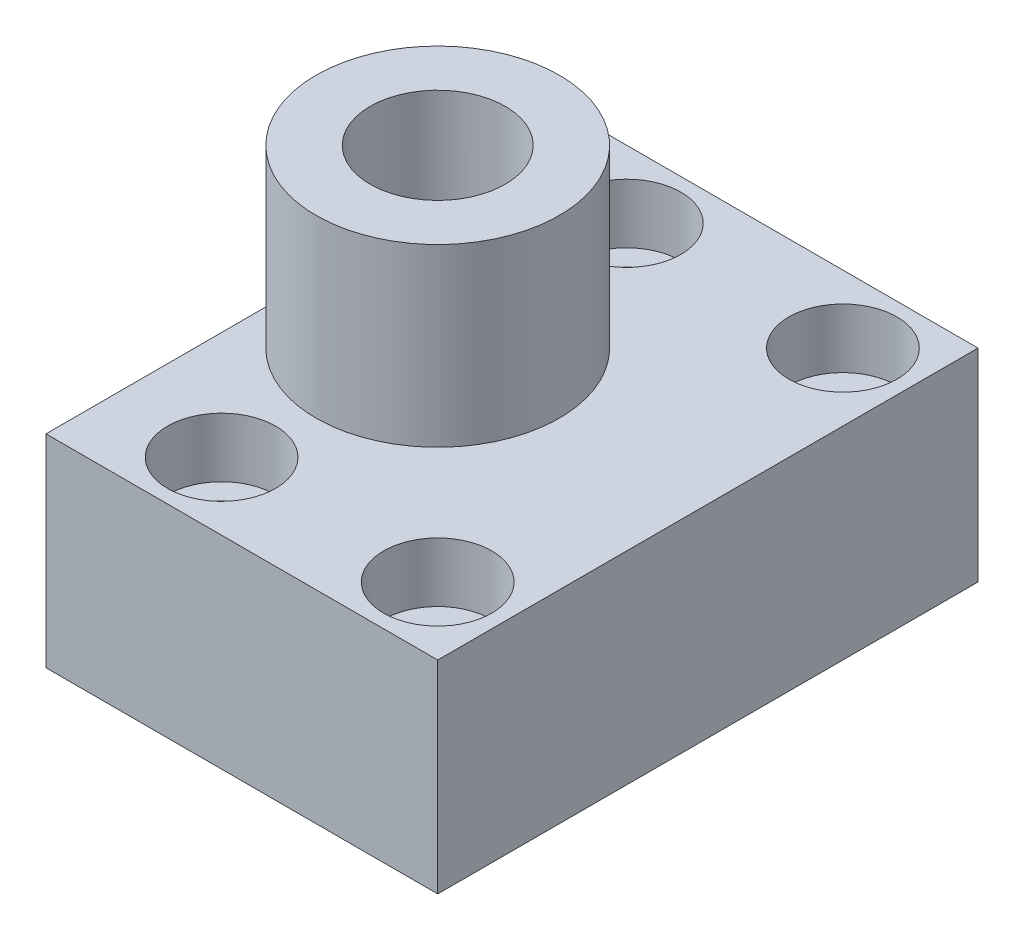
ISO-10303-21;
HEADER;
FILE_DESCRIPTION(('STEP AP214'),'2;1');
FILE_NAME('part.step','',(''),(''),'','','');
FILE_SCHEMA(('AUTOMOTIVE_DESIGN { 1 0 10303 214 1 1 1 1 }'));
ENDSEC;
DATA;
#1=APPLICATION_CONTEXT('core data for automotive mechanical design processes');
#2=APPLICATION_PROTOCOL_DEFINITION('international standard','automotive_design',2000,#1);
#3=PRODUCT_CONTEXT('',#1,'mechanical');
#4=PRODUCT('Part','Part','',(#3));
#5=PRODUCT_RELATED_PRODUCT_CATEGORY('part','',(#4));
#6=PRODUCT_DEFINITION_FORMATION('','',#4);
#7=PRODUCT_DEFINITION_CONTEXT('part definition',#1,'design');
#8=PRODUCT_DEFINITION('design','',#6,#7);
#9=PRODUCT_DEFINITION_SHAPE('','',#8);
#10=(LENGTH_UNIT() NAMED_UNIT(*) SI_UNIT(.MILLI.,.METRE.));
#11=(NAMED_UNIT(*) PLANE_ANGLE_UNIT() SI_UNIT($,.RADIAN.));
#12=(NAMED_UNIT(*) SI_UNIT($,.STERADIAN.) SOLID_ANGLE_UNIT());
#13=UNCERTAINTY_MEASURE_WITH_UNIT(LENGTH_MEASURE(1.E-05),#10,'distance_accuracy_value','');
#14=(GEOMETRIC_REPRESENTATION_CONTEXT(3) GLOBAL_UNCERTAINTY_ASSIGNED_CONTEXT((#13)) GLOBAL_UNIT_ASSIGNED_CONTEXT((#10,
#11,#12)) REPRESENTATION_CONTEXT('',''));
#15=CARTESIAN_POINT('',(0.,0.,0.));
#16=DIRECTION('',(0.,0.,1.));
#17=DIRECTION('',(1.,0.,0.));
#18=AXIS2_PLACEMENT_3D('',#15,#16,#17);
#19=CARTESIAN_POINT('',(-4.99999999999999,-26.,20.));
#20=DIRECTION('',(0.,1.,0.));
#21=DIRECTION('',(-1.,0.,0.));
#22=AXIS2_PLACEMENT_3D('',#19,#20,#21);
#23=CYLINDRICAL_SURFACE('',#22,5.);
#24=CARTESIAN_POINT('',(-5.,2.,20.));
#25=DIRECTION('',(0.,1.,0.));
#26=DIRECTION('',(-1.,0.,0.));
#27=AXIS2_PLACEMENT_3D('',#24,#25,#26);
#28=CIRCLE('',#27,5.);
#29=CARTESIAN_POINT('',(-10.,2.,20.));
#30=VERTEX_POINT('',#29);
#31=EDGE_CURVE('E108',#30,#30,#28,.T.);
#32=ORIENTED_EDGE('',*,*,#31,.T.);
#33=EDGE_LOOP('',(#32));
#34=FACE_BOUND('',#33,.T.);
#35=CARTESIAN_POINT('',(-4.99999999999999,-21.,20.));
#36=DIRECTION('',(0.,-1.,0.));
#37=DIRECTION('',(0.,0.,-1.));
#38=AXIS2_PLACEMENT_3D('',#35,#36,#37);
#39=CIRCLE('',#38,5.);
#40=CARTESIAN_POINT('',(-4.99999999999999,-21.,15.));
#41=VERTEX_POINT('',#40);
#42=EDGE_CURVE('E39',#41,#41,#39,.F.);
#43=ORIENTED_EDGE('',*,*,#42,.F.);
#44=EDGE_LOOP('',(#43));
#45=FACE_BOUND('',#44,.T.);
#46=ADVANCED_FACE('F35',(#34,#45),#23,.F.);
#47=CARTESIAN_POINT('',(0.,2.,40.));
#48=DIRECTION('',(0.,-1.,0.));
#49=DIRECTION('',(1.,0.,0.));
#50=AXIS2_PLACEMENT_3D('',#47,#48,#49);
#51=PLANE('',#50);
#52=ORIENTED_EDGE('',*,*,#31,.F.);
#53=EDGE_LOOP('',(#52));
#54=FACE_BOUND('',#53,.T.);
#55=CARTESIAN_POINT('',(-5.,2.,20.));
#56=DIRECTION('',(0.,1.,0.));
#57=DIRECTION('',(-1.,0.,0.));
#58=AXIS2_PLACEMENT_3D('',#55,#56,#57);
#59=CIRCLE('',#58,9.);
#60=CARTESIAN_POINT('',(-14.,2.,20.));
#61=VERTEX_POINT('',#60);
#62=EDGE_CURVE('E101',#61,#61,#59,.T.);
#63=ORIENTED_EDGE('',*,*,#62,.T.);
#64=EDGE_LOOP('',(#63));
#65=FACE_BOUND('',#64,.T.);
#66=ADVANCED_FACE('F142',(#54,#65),#51,.F.);
#67=CARTESIAN_POINT('',(7.5,-11.,40.));
#68=DIRECTION('',(0.,-1.,0.));
#69=DIRECTION('',(0.,0.,-1.));
#70=AXIS2_PLACEMENT_3D('',#67,#68,#69);
#71=PLANE('',#70);
#72=CARTESIAN_POINT('',(10.,-11.,35.));
#73=DIRECTION('',(0.,1.,0.));
#74=DIRECTION('',(0.,0.,1.));
#75=AXIS2_PLACEMENT_3D('',#72,#73,#74);
#76=CIRCLE('',#75,4.);
#77=CARTESIAN_POINT('',(10.,-11.,39.));
#78=VERTEX_POINT('',#77);
#79=EDGE_CURVE('E216',#78,#78,#76,.T.);
#80=ORIENTED_EDGE('',*,*,#79,.F.);
#81=EDGE_LOOP('',(#80));
#82=FACE_BOUND('',#81,.T.);
#83=CARTESIAN_POINT('',(10.,-11.,5.));
#84=DIRECTION('',(0.,1.,0.));
#85=DIRECTION('',(0.,0.,1.));
#86=AXIS2_PLACEMENT_3D('',#83,#84,#85);
#87=CIRCLE('',#86,4.);
#88=CARTESIAN_POINT('',(10.,-11.,9.));
#89=VERTEX_POINT('',#88);
#90=EDGE_CURVE('E233',#89,#89,#87,.T.);
#91=ORIENTED_EDGE('',*,*,#90,.F.);
#92=EDGE_LOOP('',(#91));
#93=FACE_BOUND('',#92,.T.);
#94=CARTESIAN_POINT('',(-6.,-11.,35.));
#95=DIRECTION('',(0.,1.,0.));
#96=DIRECTION('',(0.,0.,1.));
#97=AXIS2_PLACEMENT_3D('',#94,#95,#96);
#98=CIRCLE('',#97,4.);
#99=CARTESIAN_POINT('',(-6.,-11.,39.));
#100=VERTEX_POINT('',#99);
#101=EDGE_CURVE('E245',#100,#100,#98,.T.);
#102=ORIENTED_EDGE('',*,*,#101,.F.);
#103=EDGE_LOOP('',(#102));
#104=FACE_BOUND('',#103,.T.);
#105=CARTESIAN_POINT('',(-6.,-11.,5.));
#106=DIRECTION('',(0.,1.,0.));
#107=DIRECTION('',(0.,0.,1.));
#108=AXIS2_PLACEMENT_3D('',#105,#106,#107);
#109=CIRCLE('',#108,4.);
#110=CARTESIAN_POINT('',(-6.,-11.,9.));
#111=VERTEX_POINT('',#110);
#112=EDGE_CURVE('E257',#111,#111,#109,.T.);
#113=ORIENTED_EDGE('',*,*,#112,.F.);
#114=EDGE_LOOP('',(#113));
#115=FACE_BOUND('',#114,.T.);
#116=DIRECTION('',(-1.,0.,0.));
#117=VECTOR('',#116,1.);
#118=CARTESIAN_POINT('',(7.5,-11.,0.));
#119=LINE('',#118,#117);
#120=CARTESIAN_POINT('',(15.,-11.,0.));
#121=VERTEX_POINT('',#120);
#122=CARTESIAN_POINT('',(-14.,-11.,0.));
#123=VERTEX_POINT('',#122);
#124=EDGE_CURVE('E94',#121,#123,#119,.T.);
#125=ORIENTED_EDGE('',*,*,#124,.T.);
#126=DIRECTION('',(0.,0.,-1.));
#127=VECTOR('',#126,1.);
#128=CARTESIAN_POINT('',(-14.,-11.,40.));
#129=LINE('',#128,#127);
#130=CARTESIAN_POINT('',(-14.,-11.,20.));
#131=VERTEX_POINT('',#130);
#132=EDGE_CURVE('E88',#131,#123,#129,.T.);
#133=ORIENTED_EDGE('',*,*,#132,.F.);
#134=CARTESIAN_POINT('',(-5.,-11.,20.));
#135=DIRECTION('',(0.,-1.,0.));
#136=DIRECTION('',(0.,0.,-1.));
#137=AXIS2_PLACEMENT_3D('',#134,#135,#136);
#138=CIRCLE('',#137,9.);
#139=EDGE_CURVE('E91',#131,#131,#138,.F.);
#140=ORIENTED_EDGE('',*,*,#139,.F.);
#141=CARTESIAN_POINT('',(-14.,-11.,40.));
#142=VERTEX_POINT('',#141);
#143=EDGE_CURVE('E97',#142,#131,#129,.T.);
#144=ORIENTED_EDGE('',*,*,#143,.F.);
#145=DIRECTION('',(-1.,0.,0.));
#146=VECTOR('',#145,1.);
#147=CARTESIAN_POINT('',(7.5,-11.,40.));
#148=LINE('',#147,#146);
#149=CARTESIAN_POINT('',(15.,-11.,40.));
#150=VERTEX_POINT('',#149);
#151=EDGE_CURVE('E111',#150,#142,#148,.T.);
#152=ORIENTED_EDGE('',*,*,#151,.F.);
#153=DIRECTION('',(0.,0.,-1.));
#154=VECTOR('',#153,1.);
#155=CARTESIAN_POINT('',(15.,-11.,40.));
#156=LINE('',#155,#154);
#157=EDGE_CURVE('E117',#150,#121,#156,.T.);
#158=ORIENTED_EDGE('',*,*,#157,.T.);
#159=EDGE_LOOP('',(#125,#133,#140,#144,#152,#158));
#160=FACE_BOUND('',#159,.T.);
#161=ADVANCED_FACE('F37',(#82,#93,#104,#115,#160),#71,.F.);
#162=CARTESIAN_POINT('',(-14.,-26.,40.));
#163=DIRECTION('',(1.,0.,0.));
#164=DIRECTION('',(0.,1.,0.));
#165=AXIS2_PLACEMENT_3D('',#162,#163,#164);
#166=PLANE('',#165);
#167=DIRECTION('',(0.,-1.,0.));
#168=VECTOR('',#167,1.);
#169=CARTESIAN_POINT('',(-14.,-26.,40.));
#170=LINE('',#169,#168);
#171=CARTESIAN_POINT('',(-14.,-26.,40.));
#172=VERTEX_POINT('',#171);
#173=EDGE_CURVE('E76',#142,#172,#170,.T.);
#174=ORIENTED_EDGE('',*,*,#173,.F.);
#175=ORIENTED_EDGE('',*,*,#143,.T.);
#176=ORIENTED_EDGE('',*,*,#132,.T.);
#177=DIRECTION('',(0.,-1.,0.));
#178=VECTOR('',#177,1.);
#179=CARTESIAN_POINT('',(-14.,-26.,0.));
#180=LINE('',#179,#178);
#181=CARTESIAN_POINT('',(-14.,-26.,0.));
#182=VERTEX_POINT('',#181);
#183=EDGE_CURVE('E119',#123,#182,#180,.T.);
#184=ORIENTED_EDGE('',*,*,#183,.T.);
#185=DIRECTION('',(0.,0.,-1.));
#186=VECTOR('',#185,1.);
#187=CARTESIAN_POINT('',(-14.,-26.,40.));
#188=LINE('',#187,#186);
#189=EDGE_CURVE('E12',#172,#182,#188,.T.);
#190=ORIENTED_EDGE('',*,*,#189,.F.);
#191=EDGE_LOOP('',(#174,#175,#176,#184,#190));
#192=FACE_BOUND('',#191,.T.);
#193=ADVANCED_FACE('F128',(#192),#166,.F.);
#194=CARTESIAN_POINT('',(15.,-26.,40.));
#195=DIRECTION('',(0.,1.,0.));
#196=DIRECTION('',(0.,0.,1.));
#197=AXIS2_PLACEMENT_3D('',#194,#195,#196);
#198=PLANE('',#197);
#199=CARTESIAN_POINT('',(-4.99999999999999,-26.,20.));
#200=DIRECTION('',(0.,-1.,0.));
#201=DIRECTION('',(0.,0.,-1.));
#202=AXIS2_PLACEMENT_3D('',#199,#200,#201);
#203=CIRCLE('',#202,8.);
#204=CARTESIAN_POINT('',(-4.99999999999999,-26.,12.));
#205=VERTEX_POINT('',#204);
#206=EDGE_CURVE('E220',#205,#205,#203,.T.);
#207=ORIENTED_EDGE('',*,*,#206,.F.);
#208=EDGE_LOOP('',(#207));
#209=FACE_BOUND('',#208,.T.);
#210=CARTESIAN_POINT('',(10.,-26.,35.));
#211=DIRECTION('',(0.,1.,0.));
#212=DIRECTION('',(0.,0.,1.));
#213=AXIS2_PLACEMENT_3D('',#210,#211,#212);
#214=CIRCLE('',#213,2.25);
#215=CARTESIAN_POINT('',(10.,-26.,37.25));
#216=VERTEX_POINT('',#215);
#217=EDGE_CURVE('E230',#216,#216,#214,.T.);
#218=ORIENTED_EDGE('',*,*,#217,.T.);
#219=EDGE_LOOP('',(#218));
#220=FACE_BOUND('',#219,.T.);
#221=CARTESIAN_POINT('',(10.,-26.,5.));
#222=DIRECTION('',(0.,1.,0.));
#223=DIRECTION('',(0.,0.,1.));
#224=AXIS2_PLACEMENT_3D('',#221,#222,#223);
#225=CIRCLE('',#224,2.25);
#226=CARTESIAN_POINT('',(10.,-26.,7.25));
#227=VERTEX_POINT('',#226);
#228=EDGE_CURVE('E242',#227,#227,#225,.T.);
#229=ORIENTED_EDGE('',*,*,#228,.T.);
#230=EDGE_LOOP('',(#229));
#231=FACE_BOUND('',#230,.T.);
#232=CARTESIAN_POINT('',(-6.,-26.,35.));
#233=DIRECTION('',(0.,1.,0.));
#234=DIRECTION('',(0.,0.,1.));
#235=AXIS2_PLACEMENT_3D('',#232,#233,#234);
#236=CIRCLE('',#235,2.25);
#237=CARTESIAN_POINT('',(-6.,-26.,37.25));
#238=VERTEX_POINT('',#237);
#239=EDGE_CURVE('E254',#238,#238,#236,.T.);
#240=ORIENTED_EDGE('',*,*,#239,.T.);
#241=EDGE_LOOP('',(#240));
#242=FACE_BOUND('',#241,.T.);
#243=CARTESIAN_POINT('',(-6.,-26.,5.));
#244=DIRECTION('',(0.,1.,0.));
#245=DIRECTION('',(0.,0.,1.));
#246=AXIS2_PLACEMENT_3D('',#243,#244,#245);
#247=CIRCLE('',#246,2.25);
#248=CARTESIAN_POINT('',(-6.,-26.,7.25));
#249=VERTEX_POINT('',#248);
#250=EDGE_CURVE('E104',#249,#249,#247,.T.);
#251=ORIENTED_EDGE('',*,*,#250,.T.);
#252=EDGE_LOOP('',(#251));
#253=FACE_BOUND('',#252,.T.);
#254=DIRECTION('',(1.,0.,0.));
#255=VECTOR('',#254,1.);
#256=CARTESIAN_POINT('',(15.,-26.,0.));
#257=LINE('',#256,#255);
#258=CARTESIAN_POINT('',(15.,-26.,0.));
#259=VERTEX_POINT('',#258);
#260=EDGE_CURVE('E67',#182,#259,#257,.T.);
#261=ORIENTED_EDGE('',*,*,#260,.T.);
#262=DIRECTION('',(0.,0.,-1.));
#263=VECTOR('',#262,1.);
#264=CARTESIAN_POINT('',(15.,-26.,40.));
#265=LINE('',#264,#263);
#266=CARTESIAN_POINT('',(15.,-26.,40.));
#267=VERTEX_POINT('',#266);
#268=EDGE_CURVE('E45',#267,#259,#265,.T.);
#269=ORIENTED_EDGE('',*,*,#268,.F.);
#270=DIRECTION('',(1.,0.,0.));
#271=VECTOR('',#270,1.);
#272=CARTESIAN_POINT('',(15.,-26.,40.));
#273=LINE('',#272,#271);
#274=EDGE_CURVE('E114',#172,#267,#273,.T.);
#275=ORIENTED_EDGE('',*,*,#274,.F.);
#276=ORIENTED_EDGE('',*,*,#189,.T.);
#277=EDGE_LOOP('',(#261,#269,#275,#276));
#278=FACE_BOUND('',#277,.T.);
#279=ADVANCED_FACE('F129',(#209,#220,#231,#242,#253,#278),#198,.F.);
#280=CARTESIAN_POINT('',(15.,-11.,40.));
#281=DIRECTION('',(-1.,0.,0.));
#282=DIRECTION('',(0.,-1.,0.));
#283=AXIS2_PLACEMENT_3D('',#280,#281,#282);
#284=PLANE('',#283);
#285=DIRECTION('',(0.,1.,0.));
#286=VECTOR('',#285,1.);
#287=CARTESIAN_POINT('',(15.,-11.,0.));
#288=LINE('',#287,#286);
#289=EDGE_CURVE('E72',#259,#121,#288,.T.);
#290=ORIENTED_EDGE('',*,*,#289,.T.);
#291=ORIENTED_EDGE('',*,*,#157,.F.);
#292=DIRECTION('',(0.,1.,0.));
#293=VECTOR('',#292,1.);
#294=CARTESIAN_POINT('',(15.,-11.,40.));
#295=LINE('',#294,#293);
#296=EDGE_CURVE('E53',#267,#150,#295,.T.);
#297=ORIENTED_EDGE('',*,*,#296,.F.);
#298=ORIENTED_EDGE('',*,*,#268,.T.);
#299=EDGE_LOOP('',(#290,#291,#297,#298));
#300=FACE_BOUND('',#299,.T.);
#301=ADVANCED_FACE('F124',(#300),#284,.F.);
#302=CARTESIAN_POINT('',(15.,-11.,40.));
#303=DIRECTION('',(0.,0.,-1.));
#304=DIRECTION('',(-1.,0.,0.));
#305=AXIS2_PLACEMENT_3D('',#302,#303,#304);
#306=PLANE('',#305);
#307=ORIENTED_EDGE('',*,*,#151,.T.);
#308=ORIENTED_EDGE('',*,*,#173,.T.);
#309=ORIENTED_EDGE('',*,*,#274,.T.);
#310=ORIENTED_EDGE('',*,*,#296,.T.);
#311=EDGE_LOOP('',(#307,#308,#309,#310));
#312=FACE_BOUND('',#311,.T.);
#313=ADVANCED_FACE('F130',(#312),#306,.F.);
#314=CARTESIAN_POINT('',(15.,-11.,0.));
#315=DIRECTION('',(0.,0.,-1.));
#316=DIRECTION('',(-1.,0.,0.));
#317=AXIS2_PLACEMENT_3D('',#314,#315,#316);
#318=PLANE('',#317);
#319=ORIENTED_EDGE('',*,*,#183,.F.);
#320=ORIENTED_EDGE('',*,*,#124,.F.);
#321=ORIENTED_EDGE('',*,*,#289,.F.);
#322=ORIENTED_EDGE('',*,*,#260,.F.);
#323=EDGE_LOOP('',(#319,#320,#321,#322));
#324=FACE_BOUND('',#323,.T.);
#325=ADVANCED_FACE('F127',(#324),#318,.T.);
#326=CARTESIAN_POINT('',(-4.99999999999999,-60.9005420812239,20.));
#327=DIRECTION('',(0.,1.,0.));
#328=DIRECTION('',(-1.,0.,0.));
#329=AXIS2_PLACEMENT_3D('',#326,#327,#328);
#330=CYLINDRICAL_SURFACE('',#329,9.);
#331=ORIENTED_EDGE('',*,*,#62,.F.);
#332=EDGE_LOOP('',(#331));
#333=FACE_BOUND('',#332,.T.);
#334=ORIENTED_EDGE('',*,*,#139,.T.);
#335=EDGE_LOOP('',(#334));
#336=FACE_BOUND('',#335,.T.);
#337=ADVANCED_FACE('F100',(#333,#336),#330,.T.);
#338=CARTESIAN_POINT('',(-6.,-11.,5.));
#339=DIRECTION('',(0.,1.,0.));
#340=DIRECTION('',(0.,0.,1.));
#341=AXIS2_PLACEMENT_3D('',#338,#339,#340);
#342=CYLINDRICAL_SURFACE('',#341,2.25);
#343=ORIENTED_EDGE('',*,*,#250,.F.);
#344=EDGE_LOOP('',(#343));
#345=FACE_BOUND('',#344,.T.);
#346=CARTESIAN_POINT('',(-6.,-15.4,5.));
#347=DIRECTION('',(0.,1.,0.));
#348=DIRECTION('',(0.,0.,1.));
#349=AXIS2_PLACEMENT_3D('',#346,#347,#348);
#350=CIRCLE('',#349,2.25);
#351=CARTESIAN_POINT('',(-6.,-15.4,7.25));
#352=VERTEX_POINT('',#351);
#353=EDGE_CURVE('E263',#352,#352,#350,.T.);
#354=ORIENTED_EDGE('',*,*,#353,.T.);
#355=EDGE_LOOP('',(#354));
#356=FACE_BOUND('',#355,.T.);
#357=ADVANCED_FACE('F152',(#345,#356),#342,.F.);
#358=CARTESIAN_POINT('',(-3.75,-15.4,5.));
#359=DIRECTION('',(0.,-1.,0.));
#360=DIRECTION('',(0.,0.,-1.));
#361=AXIS2_PLACEMENT_3D('',#358,#359,#360);
#362=PLANE('',#361);
#363=ORIENTED_EDGE('',*,*,#353,.F.);
#364=EDGE_LOOP('',(#363));
#365=FACE_BOUND('',#364,.T.);
#366=CARTESIAN_POINT('',(-6.,-15.4,5.));
#367=DIRECTION('',(0.,1.,0.));
#368=DIRECTION('',(0.,0.,1.));
#369=AXIS2_PLACEMENT_3D('',#366,#367,#368);
#370=CIRCLE('',#369,4.);
#371=CARTESIAN_POINT('',(-6.,-15.4,9.));
#372=VERTEX_POINT('',#371);
#373=EDGE_CURVE('E260',#372,#372,#370,.T.);
#374=ORIENTED_EDGE('',*,*,#373,.T.);
#375=EDGE_LOOP('',(#374));
#376=FACE_BOUND('',#375,.T.);
#377=ADVANCED_FACE('F156',(#365,#376),#362,.F.);
#378=CARTESIAN_POINT('',(-6.,-11.,5.));
#379=DIRECTION('',(0.,1.,0.));
#380=DIRECTION('',(0.,0.,1.));
#381=AXIS2_PLACEMENT_3D('',#378,#379,#380);
#382=CYLINDRICAL_SURFACE('',#381,4.);
#383=ORIENTED_EDGE('',*,*,#373,.F.);
#384=EDGE_LOOP('',(#383));
#385=FACE_BOUND('',#384,.T.);
#386=ORIENTED_EDGE('',*,*,#112,.T.);
#387=EDGE_LOOP('',(#386));
#388=FACE_BOUND('',#387,.T.);
#389=ADVANCED_FACE('F160',(#385,#388),#382,.F.);
#390=CARTESIAN_POINT('',(-6.,-11.,35.));
#391=DIRECTION('',(0.,1.,0.));
#392=DIRECTION('',(0.,0.,1.));
#393=AXIS2_PLACEMENT_3D('',#390,#391,#392);
#394=CYLINDRICAL_SURFACE('',#393,2.25);
#395=ORIENTED_EDGE('',*,*,#239,.F.);
#396=EDGE_LOOP('',(#395));
#397=FACE_BOUND('',#396,.T.);
#398=CARTESIAN_POINT('',(-6.,-15.4,35.));
#399=DIRECTION('',(0.,1.,0.));
#400=DIRECTION('',(0.,0.,1.));
#401=AXIS2_PLACEMENT_3D('',#398,#399,#400);
#402=CIRCLE('',#401,2.25);
#403=CARTESIAN_POINT('',(-6.,-15.4,37.25));
#404=VERTEX_POINT('',#403);
#405=EDGE_CURVE('E251',#404,#404,#402,.T.);
#406=ORIENTED_EDGE('',*,*,#405,.T.);
#407=EDGE_LOOP('',(#406));
#408=FACE_BOUND('',#407,.T.);
#409=ADVANCED_FACE('F164',(#397,#408),#394,.F.);
#410=CARTESIAN_POINT('',(-3.75,-15.4,35.));
#411=DIRECTION('',(0.,-1.,0.));
#412=DIRECTION('',(0.,0.,-1.));
#413=AXIS2_PLACEMENT_3D('',#410,#411,#412);
#414=PLANE('',#413);
#415=ORIENTED_EDGE('',*,*,#405,.F.);
#416=EDGE_LOOP('',(#415));
#417=FACE_BOUND('',#416,.T.);
#418=CARTESIAN_POINT('',(-6.,-15.4,35.));
#419=DIRECTION('',(0.,1.,0.));
#420=DIRECTION('',(0.,0.,1.));
#421=AXIS2_PLACEMENT_3D('',#418,#419,#420);
#422=CIRCLE('',#421,4.);
#423=CARTESIAN_POINT('',(-6.,-15.4,39.));
#424=VERTEX_POINT('',#423);
#425=EDGE_CURVE('E248',#424,#424,#422,.T.);
#426=ORIENTED_EDGE('',*,*,#425,.T.);
#427=EDGE_LOOP('',(#426));
#428=FACE_BOUND('',#427,.T.);
#429=ADVANCED_FACE('F168',(#417,#428),#414,.F.);
#430=CARTESIAN_POINT('',(-6.,-11.,35.));
#431=DIRECTION('',(0.,1.,0.));
#432=DIRECTION('',(0.,0.,1.));
#433=AXIS2_PLACEMENT_3D('',#430,#431,#432);
#434=CYLINDRICAL_SURFACE('',#433,4.);
#435=ORIENTED_EDGE('',*,*,#425,.F.);
#436=EDGE_LOOP('',(#435));
#437=FACE_BOUND('',#436,.T.);
#438=ORIENTED_EDGE('',*,*,#101,.T.);
#439=EDGE_LOOP('',(#438));
#440=FACE_BOUND('',#439,.T.);
#441=ADVANCED_FACE('F172',(#437,#440),#434,.F.);
#442=CARTESIAN_POINT('',(10.,-11.,5.));
#443=DIRECTION('',(0.,1.,0.));
#444=DIRECTION('',(0.,0.,1.));
#445=AXIS2_PLACEMENT_3D('',#442,#443,#444);
#446=CYLINDRICAL_SURFACE('',#445,2.25);
#447=ORIENTED_EDGE('',*,*,#228,.F.);
#448=EDGE_LOOP('',(#447));
#449=FACE_BOUND('',#448,.T.);
#450=CARTESIAN_POINT('',(10.,-15.4,5.));
#451=DIRECTION('',(0.,1.,0.));
#452=DIRECTION('',(0.,0.,1.));
#453=AXIS2_PLACEMENT_3D('',#450,#451,#452);
#454=CIRCLE('',#453,2.25);
#455=CARTESIAN_POINT('',(10.,-15.4,7.25));
#456=VERTEX_POINT('',#455);
#457=EDGE_CURVE('E239',#456,#456,#454,.T.);
#458=ORIENTED_EDGE('',*,*,#457,.T.);
#459=EDGE_LOOP('',(#458));
#460=FACE_BOUND('',#459,.T.);
#461=ADVANCED_FACE('F176',(#449,#460),#446,.F.);
#462=CARTESIAN_POINT('',(12.25,-15.4,5.));
#463=DIRECTION('',(0.,-1.,0.));
#464=DIRECTION('',(0.,0.,-1.));
#465=AXIS2_PLACEMENT_3D('',#462,#463,#464);
#466=PLANE('',#465);
#467=ORIENTED_EDGE('',*,*,#457,.F.);
#468=EDGE_LOOP('',(#467));
#469=FACE_BOUND('',#468,.T.);
#470=CARTESIAN_POINT('',(10.,-15.4,5.));
#471=DIRECTION('',(0.,1.,0.));
#472=DIRECTION('',(0.,0.,1.));
#473=AXIS2_PLACEMENT_3D('',#470,#471,#472);
#474=CIRCLE('',#473,4.);
#475=CARTESIAN_POINT('',(10.,-15.4,9.));
#476=VERTEX_POINT('',#475);
#477=EDGE_CURVE('E236',#476,#476,#474,.T.);
#478=ORIENTED_EDGE('',*,*,#477,.T.);
#479=EDGE_LOOP('',(#478));
#480=FACE_BOUND('',#479,.T.);
#481=ADVANCED_FACE('F180',(#469,#480),#466,.F.);
#482=CARTESIAN_POINT('',(10.,-11.,5.));
#483=DIRECTION('',(0.,1.,0.));
#484=DIRECTION('',(0.,0.,1.));
#485=AXIS2_PLACEMENT_3D('',#482,#483,#484);
#486=CYLINDRICAL_SURFACE('',#485,4.);
#487=ORIENTED_EDGE('',*,*,#477,.F.);
#488=EDGE_LOOP('',(#487));
#489=FACE_BOUND('',#488,.T.);
#490=ORIENTED_EDGE('',*,*,#90,.T.);
#491=EDGE_LOOP('',(#490));
#492=FACE_BOUND('',#491,.T.);
#493=ADVANCED_FACE('F184',(#489,#492),#486,.F.);
#494=CARTESIAN_POINT('',(10.,-11.,35.));
#495=DIRECTION('',(0.,1.,0.));
#496=DIRECTION('',(0.,0.,1.));
#497=AXIS2_PLACEMENT_3D('',#494,#495,#496);
#498=CYLINDRICAL_SURFACE('',#497,2.25);
#499=ORIENTED_EDGE('',*,*,#217,.F.);
#500=EDGE_LOOP('',(#499));
#501=FACE_BOUND('',#500,.T.);
#502=CARTESIAN_POINT('',(10.,-15.4,35.));
#503=DIRECTION('',(0.,1.,0.));
#504=DIRECTION('',(0.,0.,1.));
#505=AXIS2_PLACEMENT_3D('',#502,#503,#504);
#506=CIRCLE('',#505,2.25);
#507=CARTESIAN_POINT('',(10.,-15.4,37.25));
#508=VERTEX_POINT('',#507);
#509=EDGE_CURVE('E227',#508,#508,#506,.T.);
#510=ORIENTED_EDGE('',*,*,#509,.T.);
#511=EDGE_LOOP('',(#510));
#512=FACE_BOUND('',#511,.T.);
#513=ADVANCED_FACE('F188',(#501,#512),#498,.F.);
#514=CARTESIAN_POINT('',(12.25,-15.4,35.));
#515=DIRECTION('',(0.,-1.,0.));
#516=DIRECTION('',(0.,0.,-1.));
#517=AXIS2_PLACEMENT_3D('',#514,#515,#516);
#518=PLANE('',#517);
#519=ORIENTED_EDGE('',*,*,#509,.F.);
#520=EDGE_LOOP('',(#519));
#521=FACE_BOUND('',#520,.T.);
#522=CARTESIAN_POINT('',(10.,-15.4,35.));
#523=DIRECTION('',(0.,1.,0.));
#524=DIRECTION('',(0.,0.,1.));
#525=AXIS2_PLACEMENT_3D('',#522,#523,#524);
#526=CIRCLE('',#525,4.);
#527=CARTESIAN_POINT('',(10.,-15.4,39.));
#528=VERTEX_POINT('',#527);
#529=EDGE_CURVE('E218',#528,#528,#526,.T.);
#530=ORIENTED_EDGE('',*,*,#529,.T.);
#531=EDGE_LOOP('',(#530));
#532=FACE_BOUND('',#531,.T.);
#533=ADVANCED_FACE('F192',(#521,#532),#518,.F.);
#534=CARTESIAN_POINT('',(10.,-11.,35.));
#535=DIRECTION('',(0.,1.,0.));
#536=DIRECTION('',(0.,0.,1.));
#537=AXIS2_PLACEMENT_3D('',#534,#535,#536);
#538=CYLINDRICAL_SURFACE('',#537,4.);
#539=ORIENTED_EDGE('',*,*,#529,.F.);
#540=EDGE_LOOP('',(#539));
#541=FACE_BOUND('',#540,.T.);
#542=ORIENTED_EDGE('',*,*,#79,.T.);
#543=EDGE_LOOP('',(#542));
#544=FACE_BOUND('',#543,.T.);
#545=ADVANCED_FACE('F196',(#541,#544),#538,.F.);
#546=CARTESIAN_POINT('',(-4.99999999999999,-21.,20.));
#547=DIRECTION('',(0.,-1.,0.));
#548=DIRECTION('',(0.,0.,-1.));
#549=AXIS2_PLACEMENT_3D('',#546,#547,#548);
#550=PLANE('',#549);
#551=CARTESIAN_POINT('',(-4.99999999999999,-21.,20.));
#552=DIRECTION('',(0.,-1.,0.));
#553=DIRECTION('',(0.,0.,-1.));
#554=AXIS2_PLACEMENT_3D('',#551,#552,#553);
#555=CIRCLE('',#554,8.);
#556=CARTESIAN_POINT('',(-4.99999999999999,-21.,12.));
#557=VERTEX_POINT('',#556);
#558=EDGE_CURVE('E213',#557,#557,#555,.T.);
#559=ORIENTED_EDGE('',*,*,#558,.T.);
#560=EDGE_LOOP('',(#559));
#561=FACE_BOUND('',#560,.T.);
#562=ORIENTED_EDGE('',*,*,#42,.T.);
#563=EDGE_LOOP('',(#562));
#564=FACE_BOUND('',#563,.T.);
#565=ADVANCED_FACE('F200',(#561,#564),#550,.T.);
#566=CARTESIAN_POINT('',(-4.99999999999999,-21.,20.));
#567=DIRECTION('',(0.,-1.,0.));
#568=DIRECTION('',(0.,0.,-1.));
#569=AXIS2_PLACEMENT_3D('',#566,#567,#568);
#570=CYLINDRICAL_SURFACE('',#569,8.);
#571=ORIENTED_EDGE('',*,*,#558,.F.);
#572=EDGE_LOOP('',(#571));
#573=FACE_BOUND('',#572,.T.);
#574=ORIENTED_EDGE('',*,*,#206,.T.);
#575=EDGE_LOOP('',(#574));
#576=FACE_BOUND('',#575,.T.);
#577=ADVANCED_FACE('F202',(#573,#576),#570,.F.);
#578=CLOSED_SHELL('',(#46,#66,#161,#193,#279,#301,#313,#325,#337,#357,#377,#389,#409,#429,#441,
#461,#481,#493,#513,#533,#545,#565,#577));
#579=MANIFOLD_SOLID_BREP('B2',#578);
#580=ADVANCED_BREP_SHAPE_REPRESENTATION('',(#18,#579),#14);
#581=SHAPE_DEFINITION_REPRESENTATION(#9,#580);
ENDSEC;
END-ISO-10303-21;
